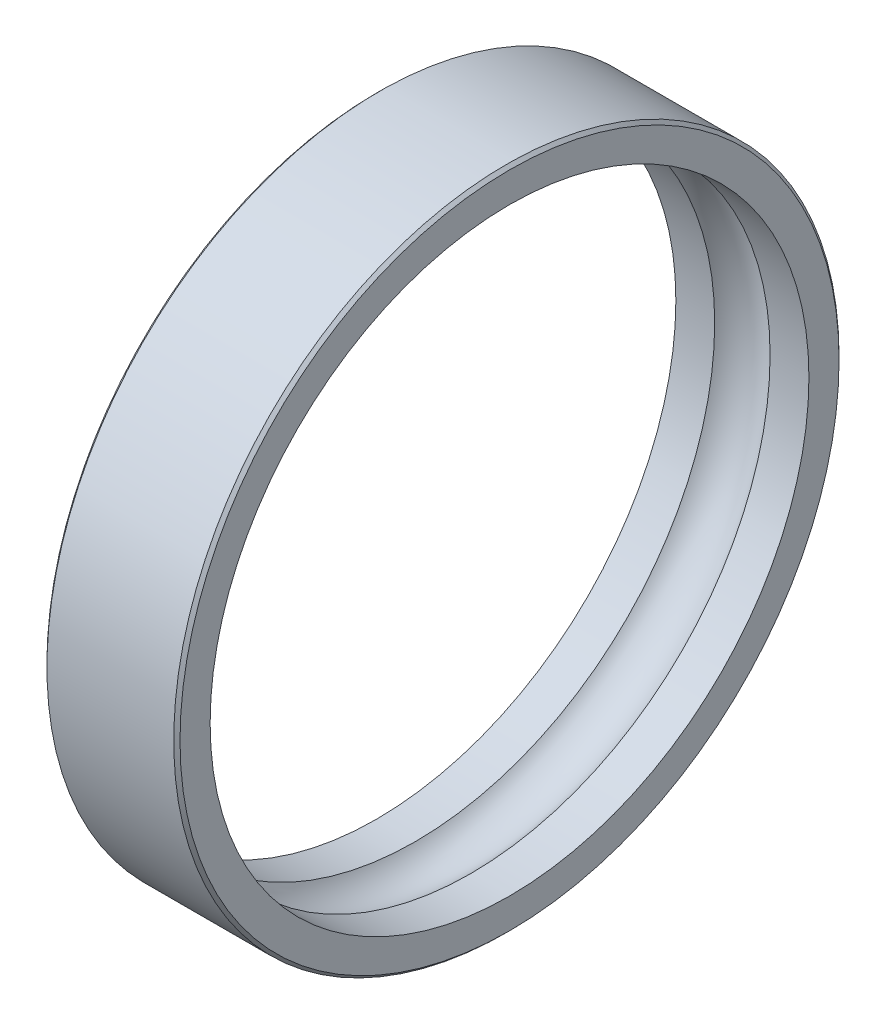
ISO-10303-21;
HEADER;
FILE_DESCRIPTION(('STEP AP214'),'2;1');
FILE_NAME('part.step','',(''),(''),'','','');
FILE_SCHEMA(('AUTOMOTIVE_DESIGN { 1 0 10303 214 1 1 1 1 }'));
ENDSEC;
DATA;
#1=APPLICATION_CONTEXT('core data for automotive mechanical design processes');
#2=APPLICATION_PROTOCOL_DEFINITION('international standard','automotive_design',2000,#1);
#3=PRODUCT_CONTEXT('',#1,'mechanical');
#4=PRODUCT('Part','Part','',(#3));
#5=PRODUCT_RELATED_PRODUCT_CATEGORY('part','',(#4));
#6=PRODUCT_DEFINITION_FORMATION('','',#4);
#7=PRODUCT_DEFINITION_CONTEXT('part definition',#1,'design');
#8=PRODUCT_DEFINITION('design','',#6,#7);
#9=PRODUCT_DEFINITION_SHAPE('','',#8);
#10=(LENGTH_UNIT() NAMED_UNIT(*) SI_UNIT(.MILLI.,.METRE.));
#11=(NAMED_UNIT(*) PLANE_ANGLE_UNIT() SI_UNIT($,.RADIAN.));
#12=(NAMED_UNIT(*) SI_UNIT($,.STERADIAN.) SOLID_ANGLE_UNIT());
#13=UNCERTAINTY_MEASURE_WITH_UNIT(LENGTH_MEASURE(1.E-05),#10,'distance_accuracy_value','');
#14=(GEOMETRIC_REPRESENTATION_CONTEXT(3) GLOBAL_UNCERTAINTY_ASSIGNED_CONTEXT((#13)) GLOBAL_UNIT_ASSIGNED_CONTEXT((#10,
#11,#12)) REPRESENTATION_CONTEXT('',''));
#15=CARTESIAN_POINT('',(0.,0.,0.));
#16=DIRECTION('',(0.,0.,1.));
#17=DIRECTION('',(1.,0.,0.));
#18=AXIS2_PLACEMENT_3D('',#15,#16,#17);
#19=CARTESIAN_POINT('',(1.5,0.,0.));
#20=DIRECTION('',(-1.,0.,0.));
#21=DIRECTION('',(0.,0.,-1.));
#22=AXIS2_PLACEMENT_3D('',#19,#20,#21);
#23=CONICAL_SURFACE('',#22,7.42928932188134,0.785398163397448);
#24=CARTESIAN_POINT('',(1.42928932188134,0.,0.));
#25=DIRECTION('',(1.,0.,0.));
#26=DIRECTION('',(0.,0.,-1.));
#27=AXIS2_PLACEMENT_3D('',#24,#25,#26);
#28=CIRCLE('',#27,7.5);
#29=CARTESIAN_POINT('',(1.42928932188134,0.,-7.5));
#30=VERTEX_POINT('',#29);
#31=EDGE_CURVE('E10',#30,#30,#28,.T.);
#32=ORIENTED_EDGE('',*,*,#31,.T.);
#33=EDGE_LOOP('',(#32));
#34=FACE_BOUND('',#33,.T.);
#35=CARTESIAN_POINT('',(1.5,0.,0.));
#36=DIRECTION('',(1.,0.,0.));
#37=DIRECTION('',(0.,0.,-1.));
#38=AXIS2_PLACEMENT_3D('',#35,#36,#37);
#39=CIRCLE('',#38,7.42928932188134);
#40=CARTESIAN_POINT('',(1.5,0.,-7.42928932188134));
#41=VERTEX_POINT('',#40);
#42=EDGE_CURVE('E61',#41,#41,#39,.T.);
#43=ORIENTED_EDGE('',*,*,#42,.F.);
#44=EDGE_LOOP('',(#43));
#45=FACE_BOUND('',#44,.T.);
#46=ADVANCED_FACE('F33',(#34,#45),#23,.T.);
#47=CARTESIAN_POINT('',(-10.2619693565684,0.,0.));
#48=DIRECTION('',(-1.,0.,0.));
#49=DIRECTION('',(0.,0.,-1.));
#50=AXIS2_PLACEMENT_3D('',#47,#48,#49);
#51=CYLINDRICAL_SURFACE('',#50,7.5);
#52=CARTESIAN_POINT('',(-1.42928932188134,0.,0.));
#53=DIRECTION('',(1.,0.,0.));
#54=DIRECTION('',(0.,0.,-1.));
#55=AXIS2_PLACEMENT_3D('',#52,#53,#54);
#56=CIRCLE('',#55,7.5);
#57=CARTESIAN_POINT('',(-1.42928932188134,0.,-7.5));
#58=VERTEX_POINT('',#57);
#59=EDGE_CURVE('E39',#58,#58,#56,.T.);
#60=ORIENTED_EDGE('',*,*,#59,.T.);
#61=EDGE_LOOP('',(#60));
#62=FACE_BOUND('',#61,.T.);
#63=ORIENTED_EDGE('',*,*,#31,.F.);
#64=EDGE_LOOP('',(#63));
#65=FACE_BOUND('',#64,.T.);
#66=ADVANCED_FACE('F69',(#62,#65),#51,.T.);
#67=CARTESIAN_POINT('',(-1.5,0.,0.));
#68=DIRECTION('',(1.,0.,0.));
#69=DIRECTION('',(0.,0.,1.));
#70=AXIS2_PLACEMENT_3D('',#67,#68,#69);
#71=CONICAL_SURFACE('',#70,7.42928932188134,0.785398163397448);
#72=ORIENTED_EDGE('',*,*,#59,.F.);
#73=EDGE_LOOP('',(#72));
#74=FACE_BOUND('',#73,.T.);
#75=CARTESIAN_POINT('',(-1.5,0.,0.));
#76=DIRECTION('',(1.,0.,0.));
#77=DIRECTION('',(0.,0.,-1.));
#78=AXIS2_PLACEMENT_3D('',#75,#76,#77);
#79=CIRCLE('',#78,7.42928932188134);
#80=CARTESIAN_POINT('',(-1.5,0.,-7.42928932188134));
#81=VERTEX_POINT('',#80);
#82=EDGE_CURVE('E43',#81,#81,#79,.T.);
#83=ORIENTED_EDGE('',*,*,#82,.T.);
#84=EDGE_LOOP('',(#83));
#85=FACE_BOUND('',#84,.T.);
#86=ADVANCED_FACE('F73',(#74,#85),#71,.T.);
#87=CARTESIAN_POINT('',(-1.5,6.75,0.));
#88=DIRECTION('',(-1.,0.,0.));
#89=DIRECTION('',(0.,0.,-1.));
#90=AXIS2_PLACEMENT_3D('',#87,#88,#89);
#91=PLANE('',#90);
#92=ORIENTED_EDGE('',*,*,#82,.F.);
#93=EDGE_LOOP('',(#92));
#94=FACE_BOUND('',#93,.T.);
#95=CARTESIAN_POINT('',(-1.5,0.,0.));
#96=DIRECTION('',(1.,0.,0.));
#97=DIRECTION('',(0.,0.,-1.));
#98=AXIS2_PLACEMENT_3D('',#95,#96,#97);
#99=CIRCLE('',#98,6.75);
#100=CARTESIAN_POINT('',(-1.5,0.,-6.75));
#101=VERTEX_POINT('',#100);
#102=EDGE_CURVE('E47',#101,#101,#99,.T.);
#103=ORIENTED_EDGE('',*,*,#102,.T.);
#104=EDGE_LOOP('',(#103));
#105=FACE_BOUND('',#104,.T.);
#106=ADVANCED_FACE('F77',(#94,#105),#91,.T.);
#107=CARTESIAN_POINT('',(-10.2619693565684,0.,0.));
#108=DIRECTION('',(-1.,0.,0.));
#109=DIRECTION('',(0.,0.,-1.));
#110=AXIS2_PLACEMENT_3D('',#107,#108,#109);
#111=CYLINDRICAL_SURFACE('',#110,6.75);
#112=CARTESIAN_POINT('',(-0.624499799839841,0.,0.));
#113=DIRECTION('',(1.,0.,0.));
#114=DIRECTION('',(0.,0.,-1.));
#115=AXIS2_PLACEMENT_3D('',#112,#113,#114);
#116=CIRCLE('',#115,6.75);
#117=CARTESIAN_POINT('',(-0.624499799839841,0.,-6.75));
#118=VERTEX_POINT('',#117);
#119=EDGE_CURVE('E52',#118,#118,#116,.T.);
#120=ORIENTED_EDGE('',*,*,#119,.T.);
#121=EDGE_LOOP('',(#120));
#122=FACE_BOUND('',#121,.T.);
#123=ORIENTED_EDGE('',*,*,#102,.F.);
#124=EDGE_LOOP('',(#123));
#125=FACE_BOUND('',#124,.T.);
#126=ADVANCED_FACE('F84',(#122,#125),#111,.F.);
#127=CARTESIAN_POINT('',(0.,0.,0.));
#128=DIRECTION('',(-1.,0.,0.));
#129=DIRECTION('',(0.,0.,-1.));
#130=AXIS2_PLACEMENT_3D('',#127,#128,#129);
#131=TOROIDAL_SURFACE('',#130,6.25,0.8);
#132=ORIENTED_EDGE('',*,*,#119,.F.);
#133=EDGE_LOOP('',(#132));
#134=FACE_BOUND('',#133,.T.);
#135=CARTESIAN_POINT('',(0.624499799839841,0.,0.));
#136=DIRECTION('',(1.,0.,0.));
#137=DIRECTION('',(0.,0.,-1.));
#138=AXIS2_PLACEMENT_3D('',#135,#136,#137);
#139=CIRCLE('',#138,6.75);
#140=CARTESIAN_POINT('',(0.624499799839841,0.,-6.75));
#141=VERTEX_POINT('',#140);
#142=EDGE_CURVE('E55',#141,#141,#139,.T.);
#143=ORIENTED_EDGE('',*,*,#142,.T.);
#144=EDGE_LOOP('',(#143));
#145=FACE_BOUND('',#144,.T.);
#146=ADVANCED_FACE('F88',(#134,#145),#131,.F.);
#147=CARTESIAN_POINT('',(-10.2619693565684,0.,0.));
#148=DIRECTION('',(-1.,0.,0.));
#149=DIRECTION('',(0.,0.,-1.));
#150=AXIS2_PLACEMENT_3D('',#147,#148,#149);
#151=CYLINDRICAL_SURFACE('',#150,6.75);
#152=CARTESIAN_POINT('',(1.5,0.,0.));
#153=DIRECTION('',(1.,0.,0.));
#154=DIRECTION('',(0.,0.,-1.));
#155=AXIS2_PLACEMENT_3D('',#152,#153,#154);
#156=CIRCLE('',#155,6.75);
#157=CARTESIAN_POINT('',(1.5,0.,-6.75));
#158=VERTEX_POINT('',#157);
#159=EDGE_CURVE('E58',#158,#158,#156,.T.);
#160=ORIENTED_EDGE('',*,*,#159,.T.);
#161=EDGE_LOOP('',(#160));
#162=FACE_BOUND('',#161,.T.);
#163=ORIENTED_EDGE('',*,*,#142,.F.);
#164=EDGE_LOOP('',(#163));
#165=FACE_BOUND('',#164,.T.);
#166=ADVANCED_FACE('F92',(#162,#165),#151,.F.);
#167=CARTESIAN_POINT('',(1.5,6.75,0.));
#168=DIRECTION('',(-1.,0.,0.));
#169=DIRECTION('',(0.,0.,-1.));
#170=AXIS2_PLACEMENT_3D('',#167,#168,#169);
#171=PLANE('',#170);
#172=ORIENTED_EDGE('',*,*,#42,.T.);
#173=EDGE_LOOP('',(#172));
#174=FACE_BOUND('',#173,.T.);
#175=ORIENTED_EDGE('',*,*,#159,.F.);
#176=EDGE_LOOP('',(#175));
#177=FACE_BOUND('',#176,.T.);
#178=ADVANCED_FACE('F65',(#174,#177),#171,.F.);
#179=CLOSED_SHELL('',(#46,#66,#86,#106,#126,#146,#166,#178));
#180=MANIFOLD_SOLID_BREP('B2',#179);
#181=ADVANCED_BREP_SHAPE_REPRESENTATION('',(#18,#180),#14);
#182=SHAPE_DEFINITION_REPRESENTATION(#9,#181);
ENDSEC;
END-ISO-10303-21;
